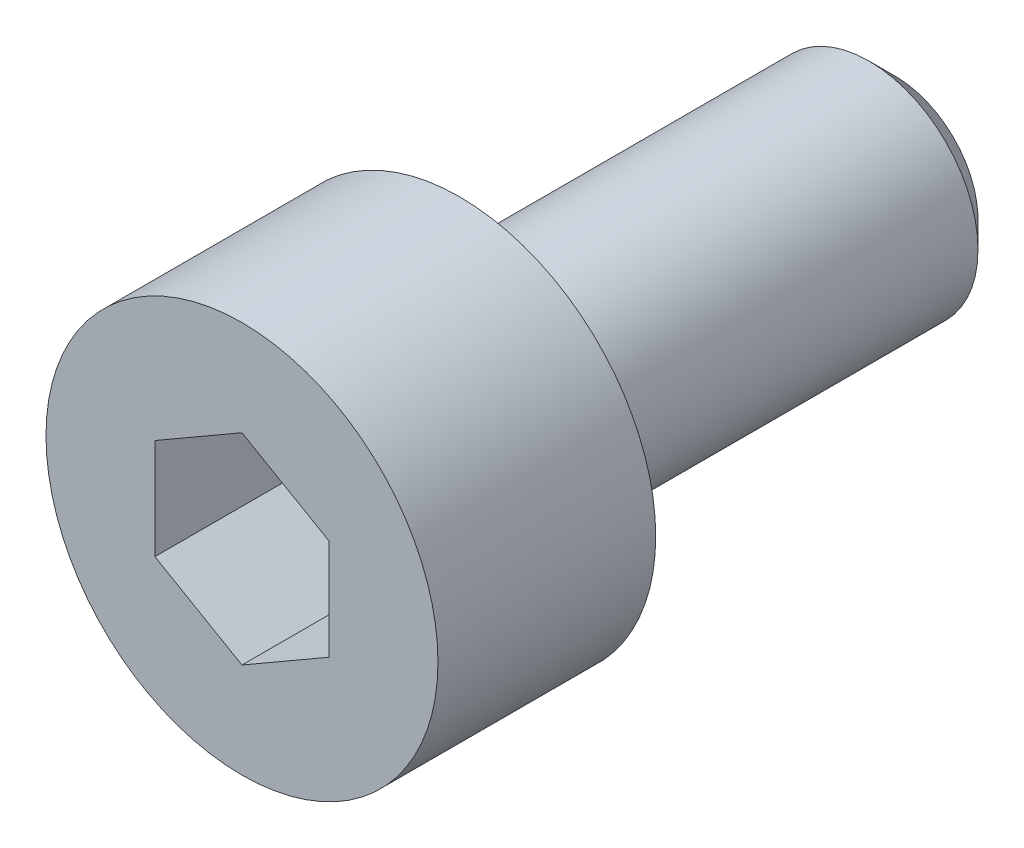
ISO-10303-21;
HEADER;
FILE_DESCRIPTION(('STEP AP214'),'2;1');
FILE_NAME('part.step','',(''),(''),'','','');
FILE_SCHEMA(('AUTOMOTIVE_DESIGN { 1 0 10303 214 1 1 1 1 }'));
ENDSEC;
DATA;
#1=APPLICATION_CONTEXT('core data for automotive mechanical design processes');
#2=APPLICATION_PROTOCOL_DEFINITION('international standard','automotive_design',2000,#1);
#3=PRODUCT_CONTEXT('',#1,'mechanical');
#4=PRODUCT('Part','Part','',(#3));
#5=PRODUCT_RELATED_PRODUCT_CATEGORY('part','',(#4));
#6=PRODUCT_DEFINITION_FORMATION('','',#4);
#7=PRODUCT_DEFINITION_CONTEXT('part definition',#1,'design');
#8=PRODUCT_DEFINITION('design','',#6,#7);
#9=PRODUCT_DEFINITION_SHAPE('','',#8);
#10=(LENGTH_UNIT() NAMED_UNIT(*) SI_UNIT(.MILLI.,.METRE.));
#11=(NAMED_UNIT(*) PLANE_ANGLE_UNIT() SI_UNIT($,.RADIAN.));
#12=(NAMED_UNIT(*) SI_UNIT($,.STERADIAN.) SOLID_ANGLE_UNIT());
#13=UNCERTAINTY_MEASURE_WITH_UNIT(LENGTH_MEASURE(1.E-05),#10,'distance_accuracy_value','');
#14=(GEOMETRIC_REPRESENTATION_CONTEXT(3) GLOBAL_UNCERTAINTY_ASSIGNED_CONTEXT((#13)) GLOBAL_UNIT_ASSIGNED_CONTEXT((#10,
#11,#12)) REPRESENTATION_CONTEXT('',''));
#15=CARTESIAN_POINT('',(0.,0.,0.));
#16=DIRECTION('',(0.,0.,1.));
#17=DIRECTION('',(1.,0.,0.));
#18=AXIS2_PLACEMENT_3D('',#15,#16,#17);
#19=CARTESIAN_POINT('',(0.,0.,0.));
#20=DIRECTION('',(0.,0.,1.));
#21=DIRECTION('',(1.,0.,0.));
#22=AXIS2_PLACEMENT_3D('',#19,#20,#21);
#23=PLANE('',#22);
#24=CARTESIAN_POINT('',(0.,0.,0.));
#25=DIRECTION('',(0.,0.,1.));
#26=DIRECTION('',(1.,0.,0.));
#27=AXIS2_PLACEMENT_3D('',#24,#25,#26);
#28=CIRCLE('',#27,2.25);
#29=CARTESIAN_POINT('',(2.25,0.,0.));
#30=VERTEX_POINT('',#29);
#31=EDGE_CURVE('E153',#30,#30,#28,.T.);
#32=ORIENTED_EDGE('',*,*,#31,.F.);
#33=EDGE_LOOP('',(#32));
#34=FACE_BOUND('',#33,.T.);
#35=CARTESIAN_POINT('',(0.,0.,0.));
#36=DIRECTION('',(0.,0.,1.));
#37=DIRECTION('',(1.,0.,0.));
#38=AXIS2_PLACEMENT_3D('',#35,#36,#37);
#39=CIRCLE('',#38,1.25);
#40=CARTESIAN_POINT('',(1.25,0.,0.));
#41=VERTEX_POINT('',#40);
#42=EDGE_CURVE('E162',#41,#41,#39,.F.);
#43=ORIENTED_EDGE('',*,*,#42,.F.);
#44=EDGE_LOOP('',(#43));
#45=FACE_BOUND('',#44,.T.);
#46=ADVANCED_FACE('F40',(#34,#45),#23,.F.);
#47=CARTESIAN_POINT('',(0.,0.,2.5));
#48=DIRECTION('',(0.,0.,-1.));
#49=DIRECTION('',(-1.,0.,0.));
#50=AXIS2_PLACEMENT_3D('',#47,#48,#49);
#51=CYLINDRICAL_SURFACE('',#50,2.25);
#52=CARTESIAN_POINT('',(0.,0.,2.5));
#53=DIRECTION('',(0.,0.,1.));
#54=DIRECTION('',(1.,0.,0.));
#55=AXIS2_PLACEMENT_3D('',#52,#53,#54);
#56=CIRCLE('',#55,2.25);
#57=CARTESIAN_POINT('',(2.25,0.,2.5));
#58=VERTEX_POINT('',#57);
#59=EDGE_CURVE('E159',#58,#58,#56,.T.);
#60=ORIENTED_EDGE('',*,*,#59,.F.);
#61=EDGE_LOOP('',(#60));
#62=FACE_BOUND('',#61,.T.);
#63=ORIENTED_EDGE('',*,*,#31,.T.);
#64=EDGE_LOOP('',(#63));
#65=FACE_BOUND('',#64,.T.);
#66=ADVANCED_FACE('F188',(#62,#65),#51,.T.);
#67=CARTESIAN_POINT('',(0.,0.,2.5));
#68=DIRECTION('',(0.,0.,1.));
#69=DIRECTION('',(1.,0.,0.));
#70=AXIS2_PLACEMENT_3D('',#67,#68,#69);
#71=PLANE('',#70);
#72=DIRECTION('',(-0.866025403784439,0.5,0.));
#73=VECTOR('',#72,1.);
#74=CARTESIAN_POINT('',(0.999999999999999,0.577350269189626,2.5));
#75=LINE('',#74,#73);
#76=CARTESIAN_POINT('',(0.999999999999999,0.577350269189626,2.5));
#77=VERTEX_POINT('',#76);
#78=CARTESIAN_POINT('',(0.,1.15470053837925,2.5));
#79=VERTEX_POINT('',#78);
#80=EDGE_CURVE('E56',#77,#79,#75,.T.);
#81=ORIENTED_EDGE('',*,*,#80,.F.);
#82=DIRECTION('',(0.,1.,0.));
#83=VECTOR('',#82,1.);
#84=CARTESIAN_POINT('',(0.999999999999999,-0.577350269189626,2.5));
#85=LINE('',#84,#83);
#86=CARTESIAN_POINT('',(0.999999999999999,-0.577350269189626,2.5));
#87=VERTEX_POINT('',#86);
#88=EDGE_CURVE('E149',#87,#77,#85,.T.);
#89=ORIENTED_EDGE('',*,*,#88,.F.);
#90=DIRECTION('',(0.866025403784439,0.5,0.));
#91=VECTOR('',#90,1.);
#92=CARTESIAN_POINT('',(0.,-1.15470053837925,2.5));
#93=LINE('',#92,#91);
#94=CARTESIAN_POINT('',(0.,-1.15470053837925,2.5));
#95=VERTEX_POINT('',#94);
#96=EDGE_CURVE('E147',#95,#87,#93,.T.);
#97=ORIENTED_EDGE('',*,*,#96,.F.);
#98=DIRECTION('',(0.866025403784438,-0.5,0.));
#99=VECTOR('',#98,1.);
#100=CARTESIAN_POINT('',(-1.,-0.577350269189626,2.5));
#101=LINE('',#100,#99);
#102=CARTESIAN_POINT('',(-1.,-0.577350269189626,2.5));
#103=VERTEX_POINT('',#102);
#104=EDGE_CURVE('E110',#103,#95,#101,.T.);
#105=ORIENTED_EDGE('',*,*,#104,.F.);
#106=DIRECTION('',(0.,-1.,0.));
#107=VECTOR('',#106,1.);
#108=CARTESIAN_POINT('',(-1.,0.577350269189626,2.5));
#109=LINE('',#108,#107);
#110=CARTESIAN_POINT('',(-1.,0.577350269189626,2.5));
#111=VERTEX_POINT('',#110);
#112=EDGE_CURVE('E143',#111,#103,#109,.T.);
#113=ORIENTED_EDGE('',*,*,#112,.F.);
#114=DIRECTION('',(-0.866025403784439,-0.5,0.));
#115=VECTOR('',#114,1.);
#116=CARTESIAN_POINT('',(0.,1.15470053837925,2.5));
#117=LINE('',#116,#115);
#118=EDGE_CURVE('E140',#79,#111,#117,.T.);
#119=ORIENTED_EDGE('',*,*,#118,.F.);
#120=EDGE_LOOP('',(#81,#89,#97,#105,#113,#119));
#121=FACE_BOUND('',#120,.T.);
#122=ORIENTED_EDGE('',*,*,#59,.T.);
#123=EDGE_LOOP('',(#122));
#124=FACE_BOUND('',#123,.T.);
#125=ADVANCED_FACE('F194',(#121,#124),#71,.T.);
#126=CARTESIAN_POINT('',(0.,0.,-5.));
#127=DIRECTION('',(0.,0.,1.));
#128=DIRECTION('',(1.,0.,0.));
#129=AXIS2_PLACEMENT_3D('',#126,#127,#128);
#130=CYLINDRICAL_SURFACE('',#129,1.25);
#131=CARTESIAN_POINT('',(0.,0.,-4.7));
#132=DIRECTION('',(0.,0.,-1.));
#133=DIRECTION('',(-1.,0.,0.));
#134=AXIS2_PLACEMENT_3D('',#131,#132,#133);
#135=CIRCLE('',#134,1.25);
#136=CARTESIAN_POINT('',(-1.25,0.,-4.7));
#137=VERTEX_POINT('',#136);
#138=EDGE_CURVE('E11',#137,#137,#135,.F.);
#139=ORIENTED_EDGE('',*,*,#138,.T.);
#140=EDGE_LOOP('',(#139));
#141=FACE_BOUND('',#140,.T.);
#142=ORIENTED_EDGE('',*,*,#42,.T.);
#143=EDGE_LOOP('',(#142));
#144=FACE_BOUND('',#143,.T.);
#145=ADVANCED_FACE('F184',(#141,#144),#130,.T.);
#146=CARTESIAN_POINT('',(0.,0.,-5.));
#147=DIRECTION('',(0.,0.,-1.));
#148=DIRECTION('',(-1.,0.,0.));
#149=AXIS2_PLACEMENT_3D('',#146,#147,#148);
#150=PLANE('',#149);
#151=CARTESIAN_POINT('',(0.,0.,-5.));
#152=DIRECTION('',(0.,0.,-1.));
#153=DIRECTION('',(-1.,0.,0.));
#154=AXIS2_PLACEMENT_3D('',#151,#152,#153);
#155=CIRCLE('',#154,0.950000000000002);
#156=CARTESIAN_POINT('',(-0.950000000000002,0.,-5.));
#157=VERTEX_POINT('',#156);
#158=EDGE_CURVE('E49',#157,#157,#155,.T.);
#159=ORIENTED_EDGE('',*,*,#158,.T.);
#160=EDGE_LOOP('',(#159));
#161=FACE_BOUND('',#160,.T.);
#162=ADVANCED_FACE('F173',(#161),#150,.T.);
#163=CARTESIAN_POINT('',(0.,0.,-5.));
#164=DIRECTION('',(0.,0.,1.));
#165=DIRECTION('',(1.,0.,0.));
#166=AXIS2_PLACEMENT_3D('',#163,#164,#165);
#167=CONICAL_SURFACE('',#166,0.950000000000002,0.785398163397448);
#168=ORIENTED_EDGE('',*,*,#138,.F.);
#169=EDGE_LOOP('',(#168));
#170=FACE_BOUND('',#169,.T.);
#171=ORIENTED_EDGE('',*,*,#158,.F.);
#172=EDGE_LOOP('',(#171));
#173=FACE_BOUND('',#172,.T.);
#174=ADVANCED_FACE('F42',(#170,#173),#167,.T.);
#175=CARTESIAN_POINT('',(0.999999999999999,0.577350269189626,0.5));
#176=DIRECTION('',(0.5,0.866025403784439,0.));
#177=DIRECTION('',(-0.866025403784439,0.5,0.));
#178=AXIS2_PLACEMENT_3D('',#175,#176,#177);
#179=PLANE('',#178);
#180=ORIENTED_EDGE('',*,*,#80,.T.);
#181=DIRECTION('',(0.,0.,1.));
#182=VECTOR('',#181,1.);
#183=CARTESIAN_POINT('',(0.,1.15470053837925,0.5));
#184=LINE('',#183,#182);
#185=CARTESIAN_POINT('',(0.,1.15470053837925,0.5));
#186=VERTEX_POINT('',#185);
#187=EDGE_CURVE('E89',#186,#79,#184,.T.);
#188=ORIENTED_EDGE('',*,*,#187,.F.);
#189=DIRECTION('',(-0.866025403784439,0.5,0.));
#190=VECTOR('',#189,1.);
#191=CARTESIAN_POINT('',(0.999999999999999,0.577350269189626,0.5));
#192=LINE('',#191,#190);
#193=CARTESIAN_POINT('',(0.999999999999999,0.577350269189626,0.5));
#194=VERTEX_POINT('',#193);
#195=EDGE_CURVE('E151',#194,#186,#192,.T.);
#196=ORIENTED_EDGE('',*,*,#195,.F.);
#197=DIRECTION('',(0.,0.,1.));
#198=VECTOR('',#197,1.);
#199=CARTESIAN_POINT('',(0.999999999999999,0.577350269189626,0.5));
#200=LINE('',#199,#198);
#201=EDGE_CURVE('E66',#194,#77,#200,.T.);
#202=ORIENTED_EDGE('',*,*,#201,.T.);
#203=EDGE_LOOP('',(#180,#188,#196,#202));
#204=FACE_BOUND('',#203,.T.);
#205=ADVANCED_FACE('F176',(#204),#179,.F.);
#206=CARTESIAN_POINT('',(0.999999999999999,-0.577350269189626,0.5));
#207=DIRECTION('',(1.,0.,0.));
#208=DIRECTION('',(0.,1.,0.));
#209=AXIS2_PLACEMENT_3D('',#206,#207,#208);
#210=PLANE('',#209);
#211=ORIENTED_EDGE('',*,*,#88,.T.);
#212=ORIENTED_EDGE('',*,*,#201,.F.);
#213=DIRECTION('',(0.,1.,0.));
#214=VECTOR('',#213,1.);
#215=CARTESIAN_POINT('',(0.999999999999999,-0.577350269189626,0.5));
#216=LINE('',#215,#214);
#217=CARTESIAN_POINT('',(0.999999999999999,-0.577350269189626,0.5));
#218=VERTEX_POINT('',#217);
#219=EDGE_CURVE('E123',#218,#194,#216,.T.);
#220=ORIENTED_EDGE('',*,*,#219,.F.);
#221=DIRECTION('',(0.,0.,1.));
#222=VECTOR('',#221,1.);
#223=CARTESIAN_POINT('',(0.999999999999999,-0.577350269189626,0.5));
#224=LINE('',#223,#222);
#225=EDGE_CURVE('E114',#218,#87,#224,.T.);
#226=ORIENTED_EDGE('',*,*,#225,.T.);
#227=EDGE_LOOP('',(#211,#212,#220,#226));
#228=FACE_BOUND('',#227,.T.);
#229=ADVANCED_FACE('F182',(#228),#210,.F.);
#230=CARTESIAN_POINT('',(0.,-1.15470053837925,0.5));
#231=DIRECTION('',(0.5,-0.866025403784439,0.));
#232=DIRECTION('',(0.866025403784439,0.5,0.));
#233=AXIS2_PLACEMENT_3D('',#230,#231,#232);
#234=PLANE('',#233);
#235=ORIENTED_EDGE('',*,*,#96,.T.);
#236=ORIENTED_EDGE('',*,*,#225,.F.);
#237=DIRECTION('',(0.866025403784439,0.5,0.));
#238=VECTOR('',#237,1.);
#239=CARTESIAN_POINT('',(0.,-1.15470053837925,0.5));
#240=LINE('',#239,#238);
#241=CARTESIAN_POINT('',(0.,-1.15470053837925,0.5));
#242=VERTEX_POINT('',#241);
#243=EDGE_CURVE('E118',#242,#218,#240,.T.);
#244=ORIENTED_EDGE('',*,*,#243,.F.);
#245=DIRECTION('',(0.,0.,1.));
#246=VECTOR('',#245,1.);
#247=CARTESIAN_POINT('',(0.,-1.15470053837925,0.5));
#248=LINE('',#247,#246);
#249=EDGE_CURVE('E103',#242,#95,#248,.T.);
#250=ORIENTED_EDGE('',*,*,#249,.T.);
#251=EDGE_LOOP('',(#235,#236,#244,#250));
#252=FACE_BOUND('',#251,.T.);
#253=ADVANCED_FACE('F119',(#252),#234,.F.);
#254=CARTESIAN_POINT('',(-1.,-0.577350269189626,0.5));
#255=DIRECTION('',(-0.5,-0.866025403784439,0.));
#256=DIRECTION('',(0.866025403784438,-0.5,0.));
#257=AXIS2_PLACEMENT_3D('',#254,#255,#256);
#258=PLANE('',#257);
#259=ORIENTED_EDGE('',*,*,#104,.T.);
#260=ORIENTED_EDGE('',*,*,#249,.F.);
#261=DIRECTION('',(0.866025403784438,-0.5,0.));
#262=VECTOR('',#261,1.);
#263=CARTESIAN_POINT('',(-1.,-0.577350269189626,0.5));
#264=LINE('',#263,#262);
#265=CARTESIAN_POINT('',(-1.,-0.577350269189626,0.5));
#266=VERTEX_POINT('',#265);
#267=EDGE_CURVE('E107',#266,#242,#264,.T.);
#268=ORIENTED_EDGE('',*,*,#267,.F.);
#269=DIRECTION('',(0.,0.,1.));
#270=VECTOR('',#269,1.);
#271=CARTESIAN_POINT('',(-1.,-0.577350269189626,0.5));
#272=LINE('',#271,#270);
#273=EDGE_CURVE('E115',#266,#103,#272,.T.);
#274=ORIENTED_EDGE('',*,*,#273,.T.);
#275=EDGE_LOOP('',(#259,#260,#268,#274));
#276=FACE_BOUND('',#275,.T.);
#277=ADVANCED_FACE('F105',(#276),#258,.F.);
#278=CARTESIAN_POINT('',(-1.,0.577350269189626,0.5));
#279=DIRECTION('',(-1.,0.,0.));
#280=DIRECTION('',(0.,0.,1.));
#281=AXIS2_PLACEMENT_3D('',#278,#279,#280);
#282=PLANE('',#281);
#283=ORIENTED_EDGE('',*,*,#112,.T.);
#284=ORIENTED_EDGE('',*,*,#273,.F.);
#285=DIRECTION('',(0.,-1.,0.));
#286=VECTOR('',#285,1.);
#287=CARTESIAN_POINT('',(-1.,0.577350269189626,0.5));
#288=LINE('',#287,#286);
#289=CARTESIAN_POINT('',(-1.,0.577350269189626,0.5));
#290=VERTEX_POINT('',#289);
#291=EDGE_CURVE('E129',#290,#266,#288,.T.);
#292=ORIENTED_EDGE('',*,*,#291,.F.);
#293=DIRECTION('',(0.,0.,1.));
#294=VECTOR('',#293,1.);
#295=CARTESIAN_POINT('',(-1.,0.577350269189626,0.5));
#296=LINE('',#295,#294);
#297=EDGE_CURVE('E156',#290,#111,#296,.T.);
#298=ORIENTED_EDGE('',*,*,#297,.T.);
#299=EDGE_LOOP('',(#283,#284,#292,#298));
#300=FACE_BOUND('',#299,.T.);
#301=ADVANCED_FACE('F208',(#300),#282,.F.);
#302=CARTESIAN_POINT('',(0.,1.15470053837925,0.5));
#303=DIRECTION('',(-0.5,0.866025403784439,0.));
#304=DIRECTION('',(-0.866025403784439,-0.5,0.));
#305=AXIS2_PLACEMENT_3D('',#302,#303,#304);
#306=PLANE('',#305);
#307=ORIENTED_EDGE('',*,*,#118,.T.);
#308=ORIENTED_EDGE('',*,*,#297,.F.);
#309=DIRECTION('',(-0.866025403784439,-0.5,0.));
#310=VECTOR('',#309,1.);
#311=CARTESIAN_POINT('',(0.,1.15470053837925,0.5));
#312=LINE('',#311,#310);
#313=EDGE_CURVE('E133',#186,#290,#312,.T.);
#314=ORIENTED_EDGE('',*,*,#313,.F.);
#315=ORIENTED_EDGE('',*,*,#187,.T.);
#316=EDGE_LOOP('',(#307,#308,#314,#315));
#317=FACE_BOUND('',#316,.T.);
#318=ADVANCED_FACE('F205',(#317),#306,.F.);
#319=CARTESIAN_POINT('',(0.,0.,0.5));
#320=DIRECTION('',(0.,0.,1.));
#321=DIRECTION('',(1.,0.,0.));
#322=AXIS2_PLACEMENT_3D('',#319,#320,#321);
#323=PLANE('',#322);
#324=ORIENTED_EDGE('',*,*,#195,.T.);
#325=ORIENTED_EDGE('',*,*,#313,.T.);
#326=ORIENTED_EDGE('',*,*,#291,.T.);
#327=ORIENTED_EDGE('',*,*,#267,.T.);
#328=ORIENTED_EDGE('',*,*,#243,.T.);
#329=ORIENTED_EDGE('',*,*,#219,.T.);
#330=EDGE_LOOP('',(#324,#325,#326,#327,#328,#329));
#331=FACE_BOUND('',#330,.T.);
#332=ADVANCED_FACE('F126',(#331),#323,.T.);
#333=CLOSED_SHELL('',(#46,#66,#125,#145,#162,#174,#205,#229,#253,#277,#301,#318,#332));
#334=MANIFOLD_SOLID_BREP('B2',#333);
#335=ADVANCED_BREP_SHAPE_REPRESENTATION('',(#18,#334),#14);
#336=SHAPE_DEFINITION_REPRESENTATION(#9,#335);
ENDSEC;
END-ISO-10303-21;
